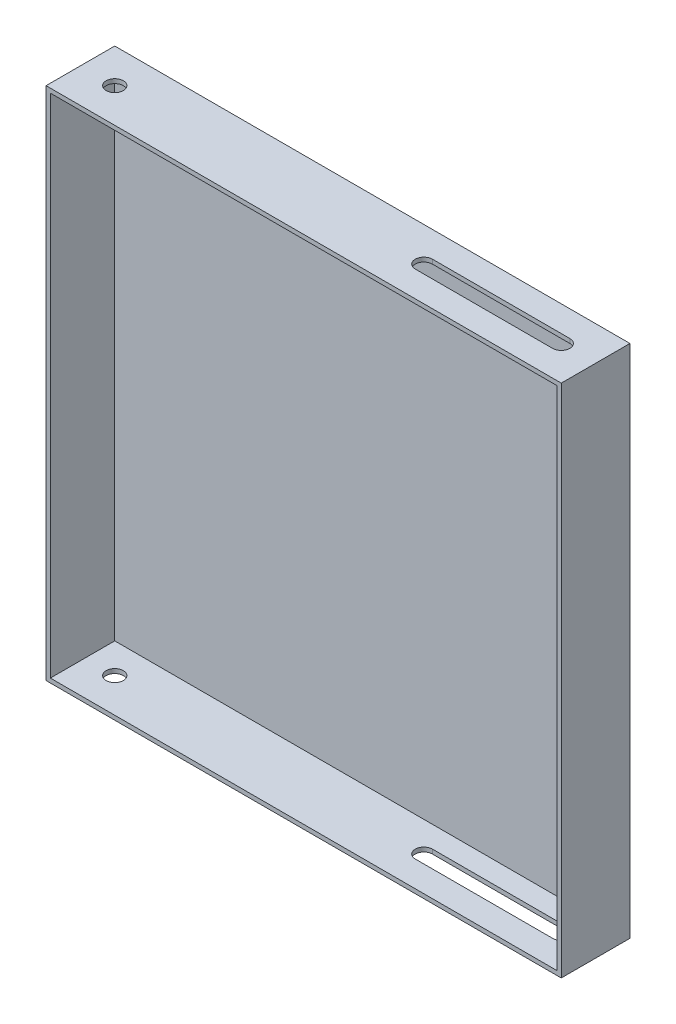
ISO-10303-21;
HEADER;
FILE_DESCRIPTION(('STEP AP214'),'2;1');
FILE_NAME('part.step','',(''),(''),'','','');
FILE_SCHEMA(('AUTOMOTIVE_DESIGN { 1 0 10303 214 1 1 1 1 }'));
ENDSEC;
DATA;
#1=APPLICATION_CONTEXT('core data for automotive mechanical design processes');
#2=APPLICATION_PROTOCOL_DEFINITION('international standard','automotive_design',2000,#1);
#3=PRODUCT_CONTEXT('',#1,'mechanical');
#4=PRODUCT('Part','Part','',(#3));
#5=PRODUCT_RELATED_PRODUCT_CATEGORY('part','',(#4));
#6=PRODUCT_DEFINITION_FORMATION('','',#4);
#7=PRODUCT_DEFINITION_CONTEXT('part definition',#1,'design');
#8=PRODUCT_DEFINITION('design','',#6,#7);
#9=PRODUCT_DEFINITION_SHAPE('','',#8);
#10=(LENGTH_UNIT() NAMED_UNIT(*) SI_UNIT(.MILLI.,.METRE.));
#11=(NAMED_UNIT(*) PLANE_ANGLE_UNIT() SI_UNIT($,.RADIAN.));
#12=(NAMED_UNIT(*) SI_UNIT($,.STERADIAN.) SOLID_ANGLE_UNIT());
#13=UNCERTAINTY_MEASURE_WITH_UNIT(LENGTH_MEASURE(1.E-05),#10,'distance_accuracy_value','');
#14=(GEOMETRIC_REPRESENTATION_CONTEXT(3) GLOBAL_UNCERTAINTY_ASSIGNED_CONTEXT((#13)) GLOBAL_UNIT_ASSIGNED_CONTEXT((#10,
#11,#12)) REPRESENTATION_CONTEXT('',''));
#15=CARTESIAN_POINT('',(0.,0.,0.));
#16=DIRECTION('',(0.,0.,1.));
#17=DIRECTION('',(1.,0.,0.));
#18=AXIS2_PLACEMENT_3D('',#15,#16,#17);
#19=CARTESIAN_POINT('',(0.,0.,50.8));
#20=DIRECTION('',(0.,0.,-1.));
#21=DIRECTION('',(-1.,0.,0.));
#22=AXIS2_PLACEMENT_3D('',#19,#20,#21);
#23=PLANE('',#22);
#24=DIRECTION('',(0.,-1.,0.));
#25=VECTOR('',#24,1.);
#26=CARTESIAN_POINT('',(0.,0.,50.8));
#27=LINE('',#26,#25);
#28=CARTESIAN_POINT('',(0.,381.,50.8));
#29=VERTEX_POINT('',#28);
#30=CARTESIAN_POINT('',(0.,0.,50.8));
#31=VERTEX_POINT('',#30);
#32=EDGE_CURVE('E242',#29,#31,#27,.T.);
#33=ORIENTED_EDGE('',*,*,#32,.T.);
#34=DIRECTION('',(1.,0.,0.));
#35=VECTOR('',#34,1.);
#36=CARTESIAN_POINT('',(0.,0.,50.8));
#37=LINE('',#36,#35);
#38=CARTESIAN_POINT('',(381.,0.,50.8));
#39=VERTEX_POINT('',#38);
#40=EDGE_CURVE('E245',#31,#39,#37,.T.);
#41=ORIENTED_EDGE('',*,*,#40,.T.);
#42=DIRECTION('',(0.,1.,0.));
#43=VECTOR('',#42,1.);
#44=CARTESIAN_POINT('',(381.,0.,50.8));
#45=LINE('',#44,#43);
#46=CARTESIAN_POINT('',(381.,381.,50.8));
#47=VERTEX_POINT('',#46);
#48=EDGE_CURVE('E248',#39,#47,#45,.T.);
#49=ORIENTED_EDGE('',*,*,#48,.T.);
#50=DIRECTION('',(-1.,0.,0.));
#51=VECTOR('',#50,1.);
#52=CARTESIAN_POINT('',(0.,381.,50.8));
#53=LINE('',#52,#51);
#54=EDGE_CURVE('E250',#47,#29,#53,.T.);
#55=ORIENTED_EDGE('',*,*,#54,.T.);
#56=EDGE_LOOP('',(#33,#41,#49,#55));
#57=FACE_BOUND('',#56,.T.);
#58=DIRECTION('',(0.,-1.,0.));
#59=VECTOR('',#58,1.);
#60=CARTESIAN_POINT('',(3.175,0.,50.8));
#61=LINE('',#60,#59);
#62=CARTESIAN_POINT('',(3.175,377.825,50.8));
#63=VERTEX_POINT('',#62);
#64=CARTESIAN_POINT('',(3.175,3.175,50.8));
#65=VERTEX_POINT('',#64);
#66=EDGE_CURVE('E234',#63,#65,#61,.T.);
#67=ORIENTED_EDGE('',*,*,#66,.F.);
#68=DIRECTION('',(-1.,0.,0.));
#69=VECTOR('',#68,1.);
#70=CARTESIAN_POINT('',(0.,377.825,50.8));
#71=LINE('',#70,#69);
#72=CARTESIAN_POINT('',(377.825,377.825,50.8));
#73=VERTEX_POINT('',#72);
#74=EDGE_CURVE('E224',#73,#63,#71,.T.);
#75=ORIENTED_EDGE('',*,*,#74,.F.);
#76=DIRECTION('',(0.,1.,0.));
#77=VECTOR('',#76,1.);
#78=CARTESIAN_POINT('',(377.825,0.,50.8));
#79=LINE('',#78,#77);
#80=CARTESIAN_POINT('',(377.825,3.175,50.8));
#81=VERTEX_POINT('',#80);
#82=EDGE_CURVE('E238',#81,#73,#79,.T.);
#83=ORIENTED_EDGE('',*,*,#82,.F.);
#84=DIRECTION('',(1.,0.,0.));
#85=VECTOR('',#84,1.);
#86=CARTESIAN_POINT('',(0.,3.175,50.8));
#87=LINE('',#86,#85);
#88=EDGE_CURVE('E236',#65,#81,#87,.T.);
#89=ORIENTED_EDGE('',*,*,#88,.F.);
#90=EDGE_LOOP('',(#67,#75,#83,#89));
#91=FACE_BOUND('',#90,.T.);
#92=ADVANCED_FACE('F33',(#57,#91),#23,.F.);
#93=CARTESIAN_POINT('',(0.,0.,50.8));
#94=DIRECTION('',(1.,0.,0.));
#95=DIRECTION('',(0.,0.,-1.));
#96=AXIS2_PLACEMENT_3D('',#93,#94,#95);
#97=PLANE('',#96);
#98=DIRECTION('',(0.,-1.,0.));
#99=VECTOR('',#98,1.);
#100=CARTESIAN_POINT('',(0.,0.,0.));
#101=LINE('',#100,#99);
#102=CARTESIAN_POINT('',(0.,381.,0.));
#103=VERTEX_POINT('',#102);
#104=CARTESIAN_POINT('',(0.,0.,0.));
#105=VERTEX_POINT('',#104);
#106=EDGE_CURVE('E218',#103,#105,#101,.T.);
#107=ORIENTED_EDGE('',*,*,#106,.T.);
#108=DIRECTION('',(0.,0.,-1.));
#109=VECTOR('',#108,1.);
#110=CARTESIAN_POINT('',(0.,0.,50.8));
#111=LINE('',#110,#109);
#112=EDGE_CURVE('E268',#31,#105,#111,.T.);
#113=ORIENTED_EDGE('',*,*,#112,.F.);
#114=ORIENTED_EDGE('',*,*,#32,.F.);
#115=DIRECTION('',(0.,0.,-1.));
#116=VECTOR('',#115,1.);
#117=CARTESIAN_POINT('',(0.,381.,50.8));
#118=LINE('',#117,#116);
#119=EDGE_CURVE('E252',#29,#103,#118,.T.);
#120=ORIENTED_EDGE('',*,*,#119,.T.);
#121=EDGE_LOOP('',(#107,#113,#114,#120));
#122=FACE_BOUND('',#121,.T.);
#123=ADVANCED_FACE('F35',(#122),#97,.F.);
#124=CARTESIAN_POINT('',(0.,0.,50.8));
#125=DIRECTION('',(0.,1.,0.));
#126=DIRECTION('',(0.,0.,1.));
#127=AXIS2_PLACEMENT_3D('',#124,#125,#126);
#128=PLANE('',#127);
#129=DIRECTION('',(-1.,0.,0.));
#130=VECTOR('',#129,1.);
#131=CARTESIAN_POINT('',(0.,0.,19.05));
#132=LINE('',#131,#130);
#133=CARTESIAN_POINT('',(355.6,0.,19.05));
#134=VERTEX_POINT('',#133);
#135=CARTESIAN_POINT('',(254.,0.,19.05));
#136=VERTEX_POINT('',#135);
#137=EDGE_CURVE('E192',#134,#136,#132,.T.);
#138=ORIENTED_EDGE('',*,*,#137,.T.);
#139=CARTESIAN_POINT('',(254.,0.,25.4));
#140=DIRECTION('',(0.,1.,0.));
#141=DIRECTION('',(0.,0.,1.));
#142=AXIS2_PLACEMENT_3D('',#139,#140,#141);
#143=CIRCLE('',#142,6.35);
#144=CARTESIAN_POINT('',(254.,0.,31.75));
#145=VERTEX_POINT('',#144);
#146=EDGE_CURVE('E198',#136,#145,#143,.T.);
#147=ORIENTED_EDGE('',*,*,#146,.T.);
#148=DIRECTION('',(-1.,0.,0.));
#149=VECTOR('',#148,1.);
#150=CARTESIAN_POINT('',(0.,0.,31.75));
#151=LINE('',#150,#149);
#152=CARTESIAN_POINT('',(355.6,0.,31.75));
#153=VERTEX_POINT('',#152);
#154=EDGE_CURVE('E183',#153,#145,#151,.T.);
#155=ORIENTED_EDGE('',*,*,#154,.F.);
#156=CARTESIAN_POINT('',(355.6,0.,25.4));
#157=DIRECTION('',(0.,1.,0.));
#158=DIRECTION('',(0.,0.,1.));
#159=AXIS2_PLACEMENT_3D('',#156,#157,#158);
#160=CIRCLE('',#159,6.35);
#161=EDGE_CURVE('E187',#153,#134,#160,.T.);
#162=ORIENTED_EDGE('',*,*,#161,.T.);
#163=EDGE_LOOP('',(#138,#147,#155,#162));
#164=FACE_BOUND('',#163,.T.);
#165=CARTESIAN_POINT('',(25.4,0.,25.4));
#166=DIRECTION('',(0.,1.,0.));
#167=DIRECTION('',(0.,0.,1.));
#168=AXIS2_PLACEMENT_3D('',#165,#166,#167);
#169=CIRCLE('',#168,6.35);
#170=CARTESIAN_POINT('',(25.4,0.,31.75));
#171=VERTEX_POINT('',#170);
#172=EDGE_CURVE('E208',#171,#171,#169,.T.);
#173=ORIENTED_EDGE('',*,*,#172,.T.);
#174=EDGE_LOOP('',(#173));
#175=FACE_BOUND('',#174,.T.);
#176=DIRECTION('',(1.,0.,0.));
#177=VECTOR('',#176,1.);
#178=CARTESIAN_POINT('',(0.,0.,0.));
#179=LINE('',#178,#177);
#180=CARTESIAN_POINT('',(381.,0.,0.));
#181=VERTEX_POINT('',#180);
#182=EDGE_CURVE('E255',#105,#181,#179,.T.);
#183=ORIENTED_EDGE('',*,*,#182,.T.);
#184=DIRECTION('',(0.,0.,-1.));
#185=VECTOR('',#184,1.);
#186=CARTESIAN_POINT('',(381.,0.,50.8));
#187=LINE('',#186,#185);
#188=EDGE_CURVE('E265',#39,#181,#187,.T.);
#189=ORIENTED_EDGE('',*,*,#188,.F.);
#190=ORIENTED_EDGE('',*,*,#40,.F.);
#191=ORIENTED_EDGE('',*,*,#112,.T.);
#192=EDGE_LOOP('',(#183,#189,#190,#191));
#193=FACE_BOUND('',#192,.T.);
#194=ADVANCED_FACE('F302',(#164,#175,#193),#128,.F.);
#195=CARTESIAN_POINT('',(381.,0.,50.8));
#196=DIRECTION('',(-1.,0.,0.));
#197=DIRECTION('',(0.,0.,1.));
#198=AXIS2_PLACEMENT_3D('',#195,#196,#197);
#199=PLANE('',#198);
#200=DIRECTION('',(0.,1.,0.));
#201=VECTOR('',#200,1.);
#202=CARTESIAN_POINT('',(381.,0.,0.));
#203=LINE('',#202,#201);
#204=CARTESIAN_POINT('',(381.,381.,0.));
#205=VERTEX_POINT('',#204);
#206=EDGE_CURVE('E257',#181,#205,#203,.T.);
#207=ORIENTED_EDGE('',*,*,#206,.T.);
#208=DIRECTION('',(0.,0.,-1.));
#209=VECTOR('',#208,1.);
#210=CARTESIAN_POINT('',(381.,381.,50.8));
#211=LINE('',#210,#209);
#212=EDGE_CURVE('E262',#47,#205,#211,.T.);
#213=ORIENTED_EDGE('',*,*,#212,.F.);
#214=ORIENTED_EDGE('',*,*,#48,.F.);
#215=ORIENTED_EDGE('',*,*,#188,.T.);
#216=EDGE_LOOP('',(#207,#213,#214,#215));
#217=FACE_BOUND('',#216,.T.);
#218=ADVANCED_FACE('F316',(#217),#199,.F.);
#219=CARTESIAN_POINT('',(0.,381.,50.8));
#220=DIRECTION('',(0.,-1.,0.));
#221=DIRECTION('',(0.,0.,-1.));
#222=AXIS2_PLACEMENT_3D('',#219,#220,#221);
#223=PLANE('',#222);
#224=DIRECTION('',(-1.,0.,0.));
#225=VECTOR('',#224,1.);
#226=CARTESIAN_POINT('',(0.,381.,31.75));
#227=LINE('',#226,#225);
#228=CARTESIAN_POINT('',(355.6,381.,31.75));
#229=VERTEX_POINT('',#228);
#230=CARTESIAN_POINT('',(254.,381.,31.75));
#231=VERTEX_POINT('',#230);
#232=EDGE_CURVE('E160',#229,#231,#227,.T.);
#233=ORIENTED_EDGE('',*,*,#232,.T.);
#234=CARTESIAN_POINT('',(254.,381.,25.4));
#235=DIRECTION('',(0.,1.,0.));
#236=DIRECTION('',(0.,0.,1.));
#237=AXIS2_PLACEMENT_3D('',#234,#235,#236);
#238=CIRCLE('',#237,6.35);
#239=CARTESIAN_POINT('',(254.,381.,19.05));
#240=VERTEX_POINT('',#239);
#241=EDGE_CURVE('E56',#240,#231,#238,.T.);
#242=ORIENTED_EDGE('',*,*,#241,.F.);
#243=DIRECTION('',(-1.,0.,0.));
#244=VECTOR('',#243,1.);
#245=CARTESIAN_POINT('',(0.,381.,19.05));
#246=LINE('',#245,#244);
#247=CARTESIAN_POINT('',(355.6,381.,19.05));
#248=VERTEX_POINT('',#247);
#249=EDGE_CURVE('E168',#248,#240,#246,.T.);
#250=ORIENTED_EDGE('',*,*,#249,.F.);
#251=CARTESIAN_POINT('',(355.6,381.,25.4));
#252=DIRECTION('',(0.,1.,0.));
#253=DIRECTION('',(0.,0.,1.));
#254=AXIS2_PLACEMENT_3D('',#251,#252,#253);
#255=CIRCLE('',#254,6.35);
#256=EDGE_CURVE('E151',#229,#248,#255,.T.);
#257=ORIENTED_EDGE('',*,*,#256,.F.);
#258=EDGE_LOOP('',(#233,#242,#250,#257));
#259=FACE_BOUND('',#258,.T.);
#260=CARTESIAN_POINT('',(25.4,381.,25.4));
#261=DIRECTION('',(0.,1.,0.));
#262=DIRECTION('',(0.,0.,1.));
#263=AXIS2_PLACEMENT_3D('',#260,#261,#262);
#264=CIRCLE('',#263,6.35);
#265=CARTESIAN_POINT('',(25.4,381.,31.75));
#266=VERTEX_POINT('',#265);
#267=EDGE_CURVE('E201',#266,#266,#264,.T.);
#268=ORIENTED_EDGE('',*,*,#267,.F.);
#269=EDGE_LOOP('',(#268));
#270=FACE_BOUND('',#269,.T.);
#271=DIRECTION('',(-1.,0.,0.));
#272=VECTOR('',#271,1.);
#273=CARTESIAN_POINT('',(0.,381.,0.));
#274=LINE('',#273,#272);
#275=EDGE_CURVE('E246',#205,#103,#274,.T.);
#276=ORIENTED_EDGE('',*,*,#275,.T.);
#277=ORIENTED_EDGE('',*,*,#119,.F.);
#278=ORIENTED_EDGE('',*,*,#54,.F.);
#279=ORIENTED_EDGE('',*,*,#212,.T.);
#280=EDGE_LOOP('',(#276,#277,#278,#279));
#281=FACE_BOUND('',#280,.T.);
#282=ADVANCED_FACE('F165',(#259,#270,#281),#223,.F.);
#283=CARTESIAN_POINT('',(0.,0.,0.));
#284=DIRECTION('',(0.,0.,-1.));
#285=DIRECTION('',(-1.,0.,0.));
#286=AXIS2_PLACEMENT_3D('',#283,#284,#285);
#287=PLANE('',#286);
#288=ORIENTED_EDGE('',*,*,#106,.F.);
#289=ORIENTED_EDGE('',*,*,#275,.F.);
#290=ORIENTED_EDGE('',*,*,#206,.F.);
#291=ORIENTED_EDGE('',*,*,#182,.F.);
#292=EDGE_LOOP('',(#288,#289,#290,#291));
#293=FACE_BOUND('',#292,.T.);
#294=ADVANCED_FACE('F309',(#293),#287,.T.);
#295=CARTESIAN_POINT('',(3.175,0.,50.8));
#296=DIRECTION('',(1.,0.,0.));
#297=DIRECTION('',(0.,0.,-1.));
#298=AXIS2_PLACEMENT_3D('',#295,#296,#297);
#299=PLANE('',#298);
#300=DIRECTION('',(0.,-1.,0.));
#301=VECTOR('',#300,1.);
#302=CARTESIAN_POINT('',(3.175,0.,3.175));
#303=LINE('',#302,#301);
#304=CARTESIAN_POINT('',(3.175,377.825,3.175));
#305=VERTEX_POINT('',#304);
#306=CARTESIAN_POINT('',(3.175,3.175,3.175));
#307=VERTEX_POINT('',#306);
#308=EDGE_CURVE('E211',#305,#307,#303,.T.);
#309=ORIENTED_EDGE('',*,*,#308,.F.);
#310=DIRECTION('',(0.,0.,-1.));
#311=VECTOR('',#310,1.);
#312=CARTESIAN_POINT('',(3.175,377.825,50.8));
#313=LINE('',#312,#311);
#314=EDGE_CURVE('E220',#63,#305,#313,.T.);
#315=ORIENTED_EDGE('',*,*,#314,.F.);
#316=ORIENTED_EDGE('',*,*,#66,.T.);
#317=DIRECTION('',(0.,0.,-1.));
#318=VECTOR('',#317,1.);
#319=CARTESIAN_POINT('',(3.175,3.175,50.8));
#320=LINE('',#319,#318);
#321=EDGE_CURVE('E215',#65,#307,#320,.T.);
#322=ORIENTED_EDGE('',*,*,#321,.T.);
#323=EDGE_LOOP('',(#309,#315,#316,#322));
#324=FACE_BOUND('',#323,.T.);
#325=ADVANCED_FACE('F312',(#324),#299,.T.);
#326=CARTESIAN_POINT('',(0.,3.175,50.8));
#327=DIRECTION('',(0.,1.,0.));
#328=DIRECTION('',(0.,0.,1.));
#329=AXIS2_PLACEMENT_3D('',#326,#327,#328);
#330=PLANE('',#329);
#331=CARTESIAN_POINT('',(254.,3.175,25.4));
#332=DIRECTION('',(0.,1.,0.));
#333=DIRECTION('',(0.,0.,1.));
#334=AXIS2_PLACEMENT_3D('',#331,#332,#333);
#335=CIRCLE('',#334,6.35);
#336=CARTESIAN_POINT('',(254.,3.175,19.05));
#337=VERTEX_POINT('',#336);
#338=CARTESIAN_POINT('',(254.,3.175,31.75));
#339=VERTEX_POINT('',#338);
#340=EDGE_CURVE('E195',#337,#339,#335,.T.);
#341=ORIENTED_EDGE('',*,*,#340,.F.);
#342=DIRECTION('',(-1.,0.,0.));
#343=VECTOR('',#342,1.);
#344=CARTESIAN_POINT('',(0.,3.175,19.05));
#345=LINE('',#344,#343);
#346=CARTESIAN_POINT('',(355.6,3.175,19.05));
#347=VERTEX_POINT('',#346);
#348=EDGE_CURVE('E190',#347,#337,#345,.T.);
#349=ORIENTED_EDGE('',*,*,#348,.F.);
#350=CARTESIAN_POINT('',(355.6,3.175,25.4));
#351=DIRECTION('',(0.,1.,0.));
#352=DIRECTION('',(0.,0.,1.));
#353=AXIS2_PLACEMENT_3D('',#350,#351,#352);
#354=CIRCLE('',#353,6.35);
#355=CARTESIAN_POINT('',(355.6,3.175,31.75));
#356=VERTEX_POINT('',#355);
#357=EDGE_CURVE('E185',#356,#347,#354,.T.);
#358=ORIENTED_EDGE('',*,*,#357,.F.);
#359=DIRECTION('',(-1.,0.,0.));
#360=VECTOR('',#359,1.);
#361=CARTESIAN_POINT('',(0.,3.175,31.75));
#362=LINE('',#361,#360);
#363=EDGE_CURVE('E180',#356,#339,#362,.T.);
#364=ORIENTED_EDGE('',*,*,#363,.T.);
#365=EDGE_LOOP('',(#341,#349,#358,#364));
#366=FACE_BOUND('',#365,.T.);
#367=CARTESIAN_POINT('',(25.4,3.175,25.4));
#368=DIRECTION('',(0.,1.,0.));
#369=DIRECTION('',(0.,0.,1.));
#370=AXIS2_PLACEMENT_3D('',#367,#368,#369);
#371=CIRCLE('',#370,6.35);
#372=CARTESIAN_POINT('',(25.4,3.175,31.75));
#373=VERTEX_POINT('',#372);
#374=EDGE_CURVE('E205',#373,#373,#371,.T.);
#375=ORIENTED_EDGE('',*,*,#374,.F.);
#376=EDGE_LOOP('',(#375));
#377=FACE_BOUND('',#376,.T.);
#378=DIRECTION('',(1.,0.,0.));
#379=VECTOR('',#378,1.);
#380=CARTESIAN_POINT('',(0.,3.175,3.175));
#381=LINE('',#380,#379);
#382=CARTESIAN_POINT('',(377.825,3.175,3.175));
#383=VERTEX_POINT('',#382);
#384=EDGE_CURVE('E214',#307,#383,#381,.T.);
#385=ORIENTED_EDGE('',*,*,#384,.F.);
#386=ORIENTED_EDGE('',*,*,#321,.F.);
#387=ORIENTED_EDGE('',*,*,#88,.T.);
#388=DIRECTION('',(0.,0.,-1.));
#389=VECTOR('',#388,1.);
#390=CARTESIAN_POINT('',(377.825,3.175,50.8));
#391=LINE('',#390,#389);
#392=EDGE_CURVE('E219',#81,#383,#391,.T.);
#393=ORIENTED_EDGE('',*,*,#392,.T.);
#394=EDGE_LOOP('',(#385,#386,#387,#393));
#395=FACE_BOUND('',#394,.T.);
#396=ADVANCED_FACE('F351',(#366,#377,#395),#330,.T.);
#397=CARTESIAN_POINT('',(377.825,0.,50.8));
#398=DIRECTION('',(-1.,0.,0.));
#399=DIRECTION('',(0.,0.,1.));
#400=AXIS2_PLACEMENT_3D('',#397,#398,#399);
#401=PLANE('',#400);
#402=DIRECTION('',(0.,1.,0.));
#403=VECTOR('',#402,1.);
#404=CARTESIAN_POINT('',(377.825,0.,3.175));
#405=LINE('',#404,#403);
#406=CARTESIAN_POINT('',(377.825,377.825,3.175));
#407=VERTEX_POINT('',#406);
#408=EDGE_CURVE('E226',#383,#407,#405,.T.);
#409=ORIENTED_EDGE('',*,*,#408,.F.);
#410=ORIENTED_EDGE('',*,*,#392,.F.);
#411=ORIENTED_EDGE('',*,*,#82,.T.);
#412=DIRECTION('',(0.,0.,-1.));
#413=VECTOR('',#412,1.);
#414=CARTESIAN_POINT('',(377.825,377.825,50.8));
#415=LINE('',#414,#413);
#416=EDGE_CURVE('E223',#73,#407,#415,.T.);
#417=ORIENTED_EDGE('',*,*,#416,.T.);
#418=EDGE_LOOP('',(#409,#410,#411,#417));
#419=FACE_BOUND('',#418,.T.);
#420=ADVANCED_FACE('F355',(#419),#401,.T.);
#421=CARTESIAN_POINT('',(0.,377.825,50.8));
#422=DIRECTION('',(0.,-1.,0.));
#423=DIRECTION('',(0.,0.,-1.));
#424=AXIS2_PLACEMENT_3D('',#421,#422,#423);
#425=PLANE('',#424);
#426=CARTESIAN_POINT('',(254.,377.825,25.4));
#427=DIRECTION('',(0.,-1.,0.));
#428=DIRECTION('',(0.,0.,-1.));
#429=AXIS2_PLACEMENT_3D('',#426,#427,#428);
#430=CIRCLE('',#429,6.35);
#431=CARTESIAN_POINT('',(254.,377.825,31.75));
#432=VERTEX_POINT('',#431);
#433=CARTESIAN_POINT('',(254.,377.825,19.05));
#434=VERTEX_POINT('',#433);
#435=EDGE_CURVE('E11',#432,#434,#430,.T.);
#436=ORIENTED_EDGE('',*,*,#435,.F.);
#437=DIRECTION('',(1.,0.,0.));
#438=VECTOR('',#437,1.);
#439=CARTESIAN_POINT('',(0.,377.825,31.75));
#440=LINE('',#439,#438);
#441=CARTESIAN_POINT('',(355.6,377.825,31.75));
#442=VERTEX_POINT('',#441);
#443=EDGE_CURVE('E271',#432,#442,#440,.T.);
#444=ORIENTED_EDGE('',*,*,#443,.T.);
#445=CARTESIAN_POINT('',(355.6,377.825,25.4));
#446=DIRECTION('',(0.,-1.,0.));
#447=DIRECTION('',(0.,0.,-1.));
#448=AXIS2_PLACEMENT_3D('',#445,#446,#447);
#449=CIRCLE('',#448,6.35);
#450=CARTESIAN_POINT('',(355.6,377.825,19.05));
#451=VERTEX_POINT('',#450);
#452=EDGE_CURVE('E154',#451,#442,#449,.T.);
#453=ORIENTED_EDGE('',*,*,#452,.F.);
#454=DIRECTION('',(1.,0.,0.));
#455=VECTOR('',#454,1.);
#456=CARTESIAN_POINT('',(0.,377.825,19.05));
#457=LINE('',#456,#455);
#458=EDGE_CURVE('E41',#434,#451,#457,.T.);
#459=ORIENTED_EDGE('',*,*,#458,.F.);
#460=EDGE_LOOP('',(#436,#444,#453,#459));
#461=FACE_BOUND('',#460,.T.);
#462=CARTESIAN_POINT('',(25.4,377.825,25.4));
#463=DIRECTION('',(0.,-1.,0.));
#464=DIRECTION('',(0.,0.,-1.));
#465=AXIS2_PLACEMENT_3D('',#462,#463,#464);
#466=CIRCLE('',#465,6.35);
#467=CARTESIAN_POINT('',(25.4,377.825,19.05));
#468=VERTEX_POINT('',#467);
#469=EDGE_CURVE('E204',#468,#468,#466,.T.);
#470=ORIENTED_EDGE('',*,*,#469,.F.);
#471=EDGE_LOOP('',(#470));
#472=FACE_BOUND('',#471,.T.);
#473=DIRECTION('',(-1.,0.,0.));
#474=VECTOR('',#473,1.);
#475=CARTESIAN_POINT('',(0.,377.825,3.175));
#476=LINE('',#475,#474);
#477=EDGE_CURVE('E230',#407,#305,#476,.T.);
#478=ORIENTED_EDGE('',*,*,#477,.F.);
#479=ORIENTED_EDGE('',*,*,#416,.F.);
#480=ORIENTED_EDGE('',*,*,#74,.T.);
#481=ORIENTED_EDGE('',*,*,#314,.T.);
#482=EDGE_LOOP('',(#478,#479,#480,#481));
#483=FACE_BOUND('',#482,.T.);
#484=ADVANCED_FACE('F281',(#461,#472,#483),#425,.T.);
#485=CARTESIAN_POINT('',(0.,0.,3.175));
#486=DIRECTION('',(0.,0.,-1.));
#487=DIRECTION('',(-1.,0.,0.));
#488=AXIS2_PLACEMENT_3D('',#485,#486,#487);
#489=PLANE('',#488);
#490=ORIENTED_EDGE('',*,*,#308,.T.);
#491=ORIENTED_EDGE('',*,*,#384,.T.);
#492=ORIENTED_EDGE('',*,*,#408,.T.);
#493=ORIENTED_EDGE('',*,*,#477,.T.);
#494=EDGE_LOOP('',(#490,#491,#492,#493));
#495=FACE_BOUND('',#494,.T.);
#496=ADVANCED_FACE('F307',(#495),#489,.F.);
#497=CARTESIAN_POINT('',(25.4,-36.576,25.4));
#498=DIRECTION('',(0.,1.,0.));
#499=DIRECTION('',(0.,0.,1.));
#500=AXIS2_PLACEMENT_3D('',#497,#498,#499);
#501=CYLINDRICAL_SURFACE('',#500,6.35);
#502=ORIENTED_EDGE('',*,*,#469,.T.);
#503=EDGE_LOOP('',(#502));
#504=FACE_BOUND('',#503,.T.);
#505=ORIENTED_EDGE('',*,*,#267,.T.);
#506=EDGE_LOOP('',(#505));
#507=FACE_BOUND('',#506,.T.);
#508=ADVANCED_FACE('F340',(#504,#507),#501,.F.);
#509=ORIENTED_EDGE('',*,*,#374,.T.);
#510=EDGE_LOOP('',(#509));
#511=FACE_BOUND('',#510,.T.);
#512=ORIENTED_EDGE('',*,*,#172,.F.);
#513=EDGE_LOOP('',(#512));
#514=FACE_BOUND('',#513,.T.);
#515=ADVANCED_FACE('F338',(#511,#514),#501,.F.);
#516=CARTESIAN_POINT('',(0.,-36.576,31.75));
#517=DIRECTION('',(0.,0.,-1.));
#518=DIRECTION('',(-1.,0.,0.));
#519=AXIS2_PLACEMENT_3D('',#516,#517,#518);
#520=PLANE('',#519);
#521=DIRECTION('',(0.,1.,0.));
#522=VECTOR('',#521,1.);
#523=CARTESIAN_POINT('',(254.,-36.576,31.75));
#524=LINE('',#523,#522);
#525=EDGE_CURVE('E162',#432,#231,#524,.T.);
#526=ORIENTED_EDGE('',*,*,#525,.T.);
#527=ORIENTED_EDGE('',*,*,#232,.F.);
#528=DIRECTION('',(0.,1.,0.));
#529=VECTOR('',#528,1.);
#530=CARTESIAN_POINT('',(355.6,-36.576,31.75));
#531=LINE('',#530,#529);
#532=EDGE_CURVE('E146',#442,#229,#531,.T.);
#533=ORIENTED_EDGE('',*,*,#532,.F.);
#534=ORIENTED_EDGE('',*,*,#443,.F.);
#535=EDGE_LOOP('',(#526,#527,#533,#534));
#536=FACE_BOUND('',#535,.T.);
#537=ADVANCED_FACE('F161',(#536),#520,.T.);
#538=CARTESIAN_POINT('',(355.6,-36.576,25.4));
#539=DIRECTION('',(0.,1.,0.));
#540=DIRECTION('',(0.,0.,1.));
#541=AXIS2_PLACEMENT_3D('',#538,#539,#540);
#542=CYLINDRICAL_SURFACE('',#541,6.35);
#543=ORIENTED_EDGE('',*,*,#452,.T.);
#544=ORIENTED_EDGE('',*,*,#532,.T.);
#545=ORIENTED_EDGE('',*,*,#256,.T.);
#546=DIRECTION('',(0.,1.,0.));
#547=VECTOR('',#546,1.);
#548=CARTESIAN_POINT('',(355.6,-36.576,19.05));
#549=LINE('',#548,#547);
#550=EDGE_CURVE('E177',#451,#248,#549,.T.);
#551=ORIENTED_EDGE('',*,*,#550,.F.);
#552=EDGE_LOOP('',(#543,#544,#545,#551));
#553=FACE_BOUND('',#552,.T.);
#554=ADVANCED_FACE('F148',(#553),#542,.F.);
#555=CARTESIAN_POINT('',(0.,-36.576,19.05));
#556=DIRECTION('',(0.,0.,-1.));
#557=DIRECTION('',(-1.,0.,0.));
#558=AXIS2_PLACEMENT_3D('',#555,#556,#557);
#559=PLANE('',#558);
#560=ORIENTED_EDGE('',*,*,#458,.T.);
#561=ORIENTED_EDGE('',*,*,#550,.T.);
#562=ORIENTED_EDGE('',*,*,#249,.T.);
#563=DIRECTION('',(0.,1.,0.));
#564=VECTOR('',#563,1.);
#565=CARTESIAN_POINT('',(254.,-36.576,19.05));
#566=LINE('',#565,#564);
#567=EDGE_CURVE('E173',#434,#240,#566,.T.);
#568=ORIENTED_EDGE('',*,*,#567,.F.);
#569=EDGE_LOOP('',(#560,#561,#562,#568));
#570=FACE_BOUND('',#569,.T.);
#571=ADVANCED_FACE('F278',(#570),#559,.F.);
#572=CARTESIAN_POINT('',(254.,-36.576,25.4));
#573=DIRECTION('',(0.,1.,0.));
#574=DIRECTION('',(0.,0.,1.));
#575=AXIS2_PLACEMENT_3D('',#572,#573,#574);
#576=CYLINDRICAL_SURFACE('',#575,6.35);
#577=ORIENTED_EDGE('',*,*,#435,.T.);
#578=ORIENTED_EDGE('',*,*,#567,.T.);
#579=ORIENTED_EDGE('',*,*,#241,.T.);
#580=ORIENTED_EDGE('',*,*,#525,.F.);
#581=EDGE_LOOP('',(#577,#578,#579,#580));
#582=FACE_BOUND('',#581,.T.);
#583=ADVANCED_FACE('F283',(#582),#576,.F.);
#584=EDGE_CURVE('E175',#136,#337,#566,.T.);
#585=ORIENTED_EDGE('',*,*,#584,.T.);
#586=ORIENTED_EDGE('',*,*,#340,.T.);
#587=EDGE_CURVE('E157',#145,#339,#524,.T.);
#588=ORIENTED_EDGE('',*,*,#587,.F.);
#589=ORIENTED_EDGE('',*,*,#146,.F.);
#590=EDGE_LOOP('',(#585,#586,#588,#589));
#591=FACE_BOUND('',#590,.T.);
#592=ADVANCED_FACE('F285',(#591),#576,.F.);
#593=EDGE_CURVE('E176',#134,#347,#549,.T.);
#594=ORIENTED_EDGE('',*,*,#593,.T.);
#595=ORIENTED_EDGE('',*,*,#348,.T.);
#596=ORIENTED_EDGE('',*,*,#584,.F.);
#597=ORIENTED_EDGE('',*,*,#137,.F.);
#598=EDGE_LOOP('',(#594,#595,#596,#597));
#599=FACE_BOUND('',#598,.T.);
#600=ADVANCED_FACE('F291',(#599),#559,.F.);
#601=EDGE_CURVE('E48',#153,#356,#531,.T.);
#602=ORIENTED_EDGE('',*,*,#601,.T.);
#603=ORIENTED_EDGE('',*,*,#357,.T.);
#604=ORIENTED_EDGE('',*,*,#593,.F.);
#605=ORIENTED_EDGE('',*,*,#161,.F.);
#606=EDGE_LOOP('',(#602,#603,#604,#605));
#607=FACE_BOUND('',#606,.T.);
#608=ADVANCED_FACE('F428',(#607),#542,.F.);
#609=ORIENTED_EDGE('',*,*,#154,.T.);
#610=ORIENTED_EDGE('',*,*,#587,.T.);
#611=ORIENTED_EDGE('',*,*,#363,.F.);
#612=ORIENTED_EDGE('',*,*,#601,.F.);
#613=EDGE_LOOP('',(#609,#610,#611,#612));
#614=FACE_BOUND('',#613,.T.);
#615=ADVANCED_FACE('F346',(#614),#520,.T.);
#616=CLOSED_SHELL('',(#92,#123,#194,#218,#282,#294,#325,#396,#420,#484,#496,#508,#515,#537,#554,
#571,#583,#592,#600,#608,#615));
#617=MANIFOLD_SOLID_BREP('B2',#616);
#618=ADVANCED_BREP_SHAPE_REPRESENTATION('',(#18,#617),#14);
#619=SHAPE_DEFINITION_REPRESENTATION(#9,#618);
ENDSEC;
END-ISO-10303-21;
